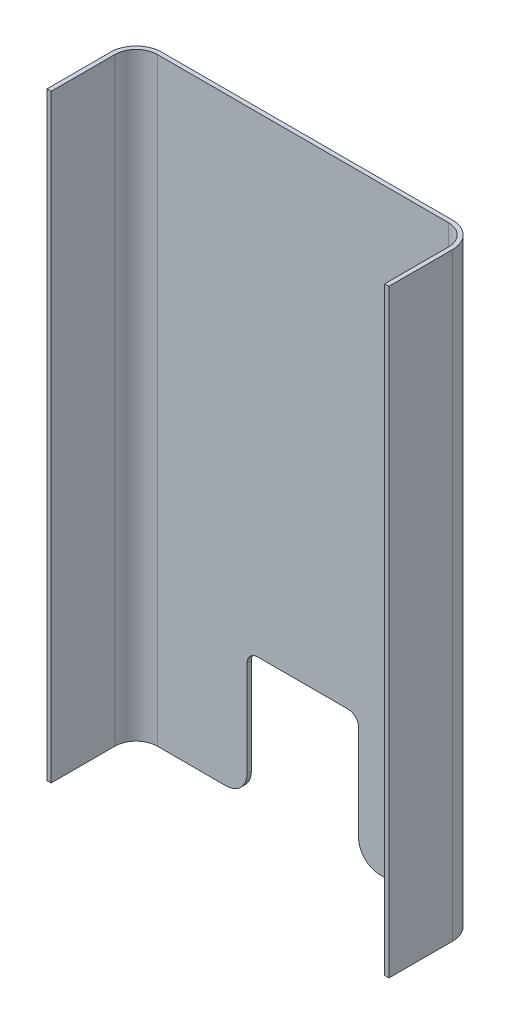
ISO-10303-21;
HEADER;
FILE_DESCRIPTION(('STEP AP214'),'2;1');
FILE_NAME('part.step','',(''),(''),'','','');
FILE_SCHEMA(('AUTOMOTIVE_DESIGN { 1 0 10303 214 1 1 1 1 }'));
ENDSEC;
DATA;
#1=APPLICATION_CONTEXT('core data for automotive mechanical design processes');
#2=APPLICATION_PROTOCOL_DEFINITION('international standard','automotive_design',2000,#1);
#3=PRODUCT_CONTEXT('',#1,'mechanical');
#4=PRODUCT('Part','Part','',(#3));
#5=PRODUCT_RELATED_PRODUCT_CATEGORY('part','',(#4));
#6=PRODUCT_DEFINITION_FORMATION('','',#4);
#7=PRODUCT_DEFINITION_CONTEXT('part definition',#1,'design');
#8=PRODUCT_DEFINITION('design','',#6,#7);
#9=PRODUCT_DEFINITION_SHAPE('','',#8);
#10=(LENGTH_UNIT() NAMED_UNIT(*) SI_UNIT(.MILLI.,.METRE.));
#11=(NAMED_UNIT(*) PLANE_ANGLE_UNIT() SI_UNIT($,.RADIAN.));
#12=(NAMED_UNIT(*) SI_UNIT($,.STERADIAN.) SOLID_ANGLE_UNIT());
#13=UNCERTAINTY_MEASURE_WITH_UNIT(LENGTH_MEASURE(1.E-05),#10,'distance_accuracy_value','');
#14=(GEOMETRIC_REPRESENTATION_CONTEXT(3) GLOBAL_UNCERTAINTY_ASSIGNED_CONTEXT((#13)) GLOBAL_UNIT_ASSIGNED_CONTEXT((#10,
#11,#12)) REPRESENTATION_CONTEXT('',''));
#15=CARTESIAN_POINT('',(0.,0.,0.));
#16=DIRECTION('',(0.,0.,1.));
#17=DIRECTION('',(1.,0.,0.));
#18=AXIS2_PLACEMENT_3D('',#15,#16,#17);
#19=CARTESIAN_POINT('',(137.,0.,20.));
#20=DIRECTION('',(0.,1.,0.));
#21=DIRECTION('',(1.,0.,0.));
#22=AXIS2_PLACEMENT_3D('',#19,#20,#21);
#23=PLANE('',#22);
#24=DIRECTION('',(1.,0.,0.));
#25=VECTOR('',#24,1.);
#26=CARTESIAN_POINT('',(-137.,0.,0.));
#27=LINE('',#26,#25);
#28=CARTESIAN_POINT('',(72.5,0.,0.));
#29=VERTEX_POINT('',#28);
#30=CARTESIAN_POINT('',(137.,0.,0.));
#31=VERTEX_POINT('',#30);
#32=EDGE_CURVE('E287',#29,#31,#27,.T.);
#33=ORIENTED_EDGE('',*,*,#32,.F.);
#34=DIRECTION('',(0.,0.,-1.));
#35=VECTOR('',#34,1.);
#36=CARTESIAN_POINT('',(72.5,0.,20.));
#37=LINE('',#36,#35);
#38=CARTESIAN_POINT('',(72.5,0.,-4.));
#39=VERTEX_POINT('',#38);
#40=EDGE_CURVE('E54',#29,#39,#37,.T.);
#41=ORIENTED_EDGE('',*,*,#40,.T.);
#42=DIRECTION('',(1.,0.,0.));
#43=VECTOR('',#42,1.);
#44=CARTESIAN_POINT('',(-137.,0.,-4.));
#45=LINE('',#44,#43);
#46=CARTESIAN_POINT('',(137.,0.,-3.99999999999999));
#47=VERTEX_POINT('',#46);
#48=EDGE_CURVE('E264',#39,#47,#45,.T.);
#49=ORIENTED_EDGE('',*,*,#48,.T.);
#50=CARTESIAN_POINT('',(137.,0.,20.));
#51=DIRECTION('',(0.,1.,0.));
#52=DIRECTION('',(1.,0.,0.));
#53=AXIS2_PLACEMENT_3D('',#50,#51,#52);
#54=CIRCLE('',#53,24.);
#55=CARTESIAN_POINT('',(161.,0.,20.));
#56=VERTEX_POINT('',#55);
#57=EDGE_CURVE('E260',#47,#56,#54,.F.);
#58=ORIENTED_EDGE('',*,*,#57,.T.);
#59=DIRECTION('',(0.,0.,-1.));
#60=VECTOR('',#59,1.);
#61=CARTESIAN_POINT('',(161.,0.,20.));
#62=LINE('',#61,#60);
#63=CARTESIAN_POINT('',(161.,0.,80.));
#64=VERTEX_POINT('',#63);
#65=EDGE_CURVE('E256',#56,#64,#62,.F.);
#66=ORIENTED_EDGE('',*,*,#65,.T.);
#67=DIRECTION('',(-1.,0.,0.));
#68=VECTOR('',#67,1.);
#69=CARTESIAN_POINT('',(161.,0.,80.));
#70=LINE('',#69,#68);
#71=CARTESIAN_POINT('',(157.,0.,80.));
#72=VERTEX_POINT('',#71);
#73=EDGE_CURVE('E252',#64,#72,#70,.T.);
#74=ORIENTED_EDGE('',*,*,#73,.T.);
#75=DIRECTION('',(0.,0.,1.));
#76=VECTOR('',#75,1.);
#77=CARTESIAN_POINT('',(157.,0.,20.));
#78=LINE('',#77,#76);
#79=CARTESIAN_POINT('',(157.,0.,20.));
#80=VERTEX_POINT('',#79);
#81=EDGE_CURVE('E202',#80,#72,#78,.T.);
#82=ORIENTED_EDGE('',*,*,#81,.F.);
#83=CARTESIAN_POINT('',(137.,0.,20.));
#84=DIRECTION('',(0.,-1.,0.));
#85=DIRECTION('',(0.,0.,-1.));
#86=AXIS2_PLACEMENT_3D('',#83,#84,#85);
#87=CIRCLE('',#86,20.);
#88=EDGE_CURVE('E196',#31,#80,#87,.T.);
#89=ORIENTED_EDGE('',*,*,#88,.F.);
#90=EDGE_LOOP('',(#33,#41,#49,#58,#66,#74,#82,#89));
#91=FACE_BOUND('',#90,.T.);
#92=ADVANCED_FACE('F45',(#91),#23,.F.);
#93=CARTESIAN_POINT('',(157.,564.,20.));
#94=DIRECTION('',(1.,0.,0.));
#95=DIRECTION('',(0.,0.,-1.));
#96=AXIS2_PLACEMENT_3D('',#93,#94,#95);
#97=PLANE('',#96);
#98=ORIENTED_EDGE('',*,*,#81,.T.);
#99=DIRECTION('',(0.,-1.,0.));
#100=VECTOR('',#99,1.);
#101=CARTESIAN_POINT('',(157.,564.,80.));
#102=LINE('',#101,#100);
#103=CARTESIAN_POINT('',(157.,564.,80.));
#104=VERTEX_POINT('',#103);
#105=EDGE_CURVE('E199',#104,#72,#102,.T.);
#106=ORIENTED_EDGE('',*,*,#105,.F.);
#107=DIRECTION('',(0.,0.,1.));
#108=VECTOR('',#107,1.);
#109=CARTESIAN_POINT('',(157.,564.,20.));
#110=LINE('',#109,#108);
#111=CARTESIAN_POINT('',(157.,564.,20.));
#112=VERTEX_POINT('',#111);
#113=EDGE_CURVE('E183',#112,#104,#110,.T.);
#114=ORIENTED_EDGE('',*,*,#113,.F.);
#115=DIRECTION('',(0.,-1.,0.));
#116=VECTOR('',#115,1.);
#117=CARTESIAN_POINT('',(157.,564.,20.));
#118=LINE('',#117,#116);
#119=EDGE_CURVE('E249',#112,#80,#118,.T.);
#120=ORIENTED_EDGE('',*,*,#119,.T.);
#121=EDGE_LOOP('',(#98,#106,#114,#120));
#122=FACE_BOUND('',#121,.T.);
#123=ADVANCED_FACE('F200',(#122),#97,.F.);
#124=CARTESIAN_POINT('',(161.,564.,80.));
#125=DIRECTION('',(0.,0.,1.));
#126=DIRECTION('',(1.,0.,0.));
#127=AXIS2_PLACEMENT_3D('',#124,#125,#126);
#128=PLANE('',#127);
#129=ORIENTED_EDGE('',*,*,#73,.F.);
#130=DIRECTION('',(0.,-1.,0.));
#131=VECTOR('',#130,1.);
#132=CARTESIAN_POINT('',(161.,564.,80.));
#133=LINE('',#132,#131);
#134=CARTESIAN_POINT('',(161.,564.,80.));
#135=VERTEX_POINT('',#134);
#136=EDGE_CURVE('E208',#135,#64,#133,.T.);
#137=ORIENTED_EDGE('',*,*,#136,.F.);
#138=DIRECTION('',(-1.,0.,0.));
#139=VECTOR('',#138,1.);
#140=CARTESIAN_POINT('',(161.,564.,80.));
#141=LINE('',#140,#139);
#142=EDGE_CURVE('E188',#135,#104,#141,.T.);
#143=ORIENTED_EDGE('',*,*,#142,.T.);
#144=ORIENTED_EDGE('',*,*,#105,.T.);
#145=EDGE_LOOP('',(#129,#137,#143,#144));
#146=FACE_BOUND('',#145,.T.);
#147=ADVANCED_FACE('F210',(#146),#128,.T.);
#148=CARTESIAN_POINT('',(161.,564.,20.));
#149=DIRECTION('',(1.,0.,0.));
#150=DIRECTION('',(0.,0.,-1.));
#151=AXIS2_PLACEMENT_3D('',#148,#149,#150);
#152=PLANE('',#151);
#153=ORIENTED_EDGE('',*,*,#65,.F.);
#154=DIRECTION('',(0.,-1.,0.));
#155=VECTOR('',#154,1.);
#156=CARTESIAN_POINT('',(161.,564.,20.));
#157=LINE('',#156,#155);
#158=CARTESIAN_POINT('',(161.,564.,20.));
#159=VERTEX_POINT('',#158);
#160=EDGE_CURVE('E324',#159,#56,#157,.T.);
#161=ORIENTED_EDGE('',*,*,#160,.F.);
#162=DIRECTION('',(0.,0.,-1.));
#163=VECTOR('',#162,1.);
#164=CARTESIAN_POINT('',(161.,564.,20.));
#165=LINE('',#164,#163);
#166=EDGE_CURVE('E212',#159,#135,#165,.F.);
#167=ORIENTED_EDGE('',*,*,#166,.T.);
#168=ORIENTED_EDGE('',*,*,#136,.T.);
#169=EDGE_LOOP('',(#153,#161,#167,#168));
#170=FACE_BOUND('',#169,.T.);
#171=ADVANCED_FACE('F484',(#170),#152,.T.);
#172=CARTESIAN_POINT('',(137.,564.,20.));
#173=DIRECTION('',(0.,-1.,0.));
#174=DIRECTION('',(0.,0.,-1.));
#175=AXIS2_PLACEMENT_3D('',#172,#173,#174);
#176=CYLINDRICAL_SURFACE('',#175,24.);
#177=ORIENTED_EDGE('',*,*,#57,.F.);
#178=DIRECTION('',(0.,-1.,0.));
#179=VECTOR('',#178,1.);
#180=CARTESIAN_POINT('',(137.,564.,-3.99999999999999));
#181=LINE('',#180,#179);
#182=CARTESIAN_POINT('',(137.,564.,-3.99999999999999));
#183=VERTEX_POINT('',#182);
#184=EDGE_CURVE('E320',#183,#47,#181,.T.);
#185=ORIENTED_EDGE('',*,*,#184,.F.);
#186=CARTESIAN_POINT('',(137.,564.,20.));
#187=DIRECTION('',(0.,1.,0.));
#188=DIRECTION('',(1.,0.,0.));
#189=AXIS2_PLACEMENT_3D('',#186,#187,#188);
#190=CIRCLE('',#189,24.);
#191=EDGE_CURVE('E215',#183,#159,#190,.F.);
#192=ORIENTED_EDGE('',*,*,#191,.T.);
#193=ORIENTED_EDGE('',*,*,#160,.T.);
#194=EDGE_LOOP('',(#177,#185,#192,#193));
#195=FACE_BOUND('',#194,.T.);
#196=ADVANCED_FACE('F486',(#195),#176,.T.);
#197=CARTESIAN_POINT('',(-137.,564.,-4.));
#198=DIRECTION('',(0.,0.,-1.));
#199=DIRECTION('',(-1.,0.,0.));
#200=AXIS2_PLACEMENT_3D('',#197,#198,#199);
#201=PLANE('',#200);
#202=DIRECTION('',(0.,1.,0.));
#203=VECTOR('',#202,1.);
#204=CARTESIAN_POINT('',(-52.5,564.,-4.));
#205=LINE('',#204,#203);
#206=CARTESIAN_POINT('',(-52.5,20.,-4.));
#207=VERTEX_POINT('',#206);
#208=CARTESIAN_POINT('',(-52.5,110.,-4.));
#209=VERTEX_POINT('',#208);
#210=EDGE_CURVE('E395',#207,#209,#205,.T.);
#211=ORIENTED_EDGE('',*,*,#210,.F.);
#212=CARTESIAN_POINT('',(-72.5,20.,-4.));
#213=DIRECTION('',(0.,0.,-1.));
#214=DIRECTION('',(-1.,0.,0.));
#215=AXIS2_PLACEMENT_3D('',#212,#213,#214);
#216=CIRCLE('',#215,20.);
#217=CARTESIAN_POINT('',(-72.5,0.,-4.));
#218=VERTEX_POINT('',#217);
#219=EDGE_CURVE('E375',#207,#218,#216,.T.);
#220=ORIENTED_EDGE('',*,*,#219,.T.);
#221=CARTESIAN_POINT('',(-137.,0.,-4.));
#222=VERTEX_POINT('',#221);
#223=EDGE_CURVE('E265',#222,#218,#45,.T.);
#224=ORIENTED_EDGE('',*,*,#223,.F.);
#225=DIRECTION('',(0.,-1.,0.));
#226=VECTOR('',#225,1.);
#227=CARTESIAN_POINT('',(-137.,564.,-4.));
#228=LINE('',#227,#226);
#229=CARTESIAN_POINT('',(-137.,564.,-4.));
#230=VERTEX_POINT('',#229);
#231=EDGE_CURVE('E317',#230,#222,#228,.T.);
#232=ORIENTED_EDGE('',*,*,#231,.F.);
#233=DIRECTION('',(1.,0.,0.));
#234=VECTOR('',#233,1.);
#235=CARTESIAN_POINT('',(-137.,564.,-4.));
#236=LINE('',#235,#234);
#237=EDGE_CURVE('E222',#230,#183,#236,.T.);
#238=ORIENTED_EDGE('',*,*,#237,.T.);
#239=ORIENTED_EDGE('',*,*,#184,.T.);
#240=ORIENTED_EDGE('',*,*,#48,.F.);
#241=CARTESIAN_POINT('',(72.5,20.,-4.));
#242=DIRECTION('',(0.,0.,-1.));
#243=DIRECTION('',(-1.,0.,0.));
#244=AXIS2_PLACEMENT_3D('',#241,#242,#243);
#245=CIRCLE('',#244,20.);
#246=CARTESIAN_POINT('',(52.5,20.,-4.));
#247=VERTEX_POINT('',#246);
#248=EDGE_CURVE('E61',#39,#247,#245,.T.);
#249=ORIENTED_EDGE('',*,*,#248,.T.);
#250=DIRECTION('',(0.,-1.,0.));
#251=VECTOR('',#250,1.);
#252=CARTESIAN_POINT('',(52.5,564.,-4.));
#253=LINE('',#252,#251);
#254=CARTESIAN_POINT('',(52.5,110.,-4.));
#255=VERTEX_POINT('',#254);
#256=EDGE_CURVE('E389',#255,#247,#253,.T.);
#257=ORIENTED_EDGE('',*,*,#256,.F.);
#258=CARTESIAN_POINT('',(42.5,110.,-4.));
#259=DIRECTION('',(0.,0.,-1.));
#260=DIRECTION('',(-1.,0.,0.));
#261=AXIS2_PLACEMENT_3D('',#258,#259,#260);
#262=CIRCLE('',#261,10.);
#263=CARTESIAN_POINT('',(42.5,120.,-4.));
#264=VERTEX_POINT('',#263);
#265=EDGE_CURVE('E354',#255,#264,#262,.F.);
#266=ORIENTED_EDGE('',*,*,#265,.T.);
#267=DIRECTION('',(1.,0.,0.));
#268=VECTOR('',#267,1.);
#269=CARTESIAN_POINT('',(-137.,120.,-4.));
#270=LINE('',#269,#268);
#271=CARTESIAN_POINT('',(-42.5,120.,-4.));
#272=VERTEX_POINT('',#271);
#273=EDGE_CURVE('E253',#272,#264,#270,.T.);
#274=ORIENTED_EDGE('',*,*,#273,.F.);
#275=CARTESIAN_POINT('',(-42.5,110.,-4.));
#276=DIRECTION('',(0.,0.,-1.));
#277=DIRECTION('',(-1.,0.,0.));
#278=AXIS2_PLACEMENT_3D('',#275,#276,#277);
#279=CIRCLE('',#278,10.);
#280=EDGE_CURVE('E347',#272,#209,#279,.F.);
#281=ORIENTED_EDGE('',*,*,#280,.T.);
#282=EDGE_LOOP('',(#211,#220,#224,#232,#238,#239,#240,#249,#257,#266,#274,#281));
#283=FACE_BOUND('',#282,.T.);
#284=ADVANCED_FACE('F383',(#283),#201,.T.);
#285=CARTESIAN_POINT('',(-137.,564.,20.));
#286=DIRECTION('',(0.,-1.,0.));
#287=DIRECTION('',(0.,0.,-1.));
#288=AXIS2_PLACEMENT_3D('',#285,#286,#287);
#289=CYLINDRICAL_SURFACE('',#288,24.);
#290=CARTESIAN_POINT('',(-137.,0.,20.));
#291=DIRECTION('',(0.,1.,0.));
#292=DIRECTION('',(1.,0.,0.));
#293=AXIS2_PLACEMENT_3D('',#290,#291,#292);
#294=CIRCLE('',#293,24.);
#295=CARTESIAN_POINT('',(-161.,0.,20.));
#296=VERTEX_POINT('',#295);
#297=EDGE_CURVE('E269',#296,#222,#294,.F.);
#298=ORIENTED_EDGE('',*,*,#297,.F.);
#299=DIRECTION('',(0.,-1.,0.));
#300=VECTOR('',#299,1.);
#301=CARTESIAN_POINT('',(-161.,564.,20.));
#302=LINE('',#301,#300);
#303=CARTESIAN_POINT('',(-161.,564.,20.));
#304=VERTEX_POINT('',#303);
#305=EDGE_CURVE('E314',#304,#296,#302,.T.);
#306=ORIENTED_EDGE('',*,*,#305,.F.);
#307=CARTESIAN_POINT('',(-137.,564.,20.));
#308=DIRECTION('',(0.,1.,0.));
#309=DIRECTION('',(1.,0.,0.));
#310=AXIS2_PLACEMENT_3D('',#307,#308,#309);
#311=CIRCLE('',#310,24.);
#312=EDGE_CURVE('E226',#304,#230,#311,.F.);
#313=ORIENTED_EDGE('',*,*,#312,.T.);
#314=ORIENTED_EDGE('',*,*,#231,.T.);
#315=EDGE_LOOP('',(#298,#306,#313,#314));
#316=FACE_BOUND('',#315,.T.);
#317=ADVANCED_FACE('F461',(#316),#289,.T.);
#318=CARTESIAN_POINT('',(-161.,564.,80.));
#319=DIRECTION('',(-1.,0.,0.));
#320=DIRECTION('',(0.,0.,1.));
#321=AXIS2_PLACEMENT_3D('',#318,#319,#320);
#322=PLANE('',#321);
#323=DIRECTION('',(0.,0.,-1.));
#324=VECTOR('',#323,1.);
#325=CARTESIAN_POINT('',(-161.,0.,80.));
#326=LINE('',#325,#324);
#327=CARTESIAN_POINT('',(-161.,0.,80.));
#328=VERTEX_POINT('',#327);
#329=EDGE_CURVE('E273',#328,#296,#326,.T.);
#330=ORIENTED_EDGE('',*,*,#329,.F.);
#331=DIRECTION('',(0.,-1.,0.));
#332=VECTOR('',#331,1.);
#333=CARTESIAN_POINT('',(-161.,564.,80.));
#334=LINE('',#333,#332);
#335=CARTESIAN_POINT('',(-161.,564.,80.));
#336=VERTEX_POINT('',#335);
#337=EDGE_CURVE('E311',#336,#328,#334,.T.);
#338=ORIENTED_EDGE('',*,*,#337,.F.);
#339=DIRECTION('',(0.,0.,-1.));
#340=VECTOR('',#339,1.);
#341=CARTESIAN_POINT('',(-161.,564.,80.));
#342=LINE('',#341,#340);
#343=EDGE_CURVE('E230',#336,#304,#342,.T.);
#344=ORIENTED_EDGE('',*,*,#343,.T.);
#345=ORIENTED_EDGE('',*,*,#305,.T.);
#346=EDGE_LOOP('',(#330,#338,#344,#345));
#347=FACE_BOUND('',#346,.T.);
#348=ADVANCED_FACE('F464',(#347),#322,.T.);
#349=CARTESIAN_POINT('',(-157.,564.,80.));
#350=DIRECTION('',(0.,0.,1.));
#351=DIRECTION('',(1.,0.,0.));
#352=AXIS2_PLACEMENT_3D('',#349,#350,#351);
#353=PLANE('',#352);
#354=DIRECTION('',(-1.,0.,0.));
#355=VECTOR('',#354,1.);
#356=CARTESIAN_POINT('',(-157.,0.,80.));
#357=LINE('',#356,#355);
#358=CARTESIAN_POINT('',(-157.,0.,80.));
#359=VERTEX_POINT('',#358);
#360=EDGE_CURVE('E277',#359,#328,#357,.T.);
#361=ORIENTED_EDGE('',*,*,#360,.F.);
#362=DIRECTION('',(0.,-1.,0.));
#363=VECTOR('',#362,1.);
#364=CARTESIAN_POINT('',(-157.,564.,80.));
#365=LINE('',#364,#363);
#366=CARTESIAN_POINT('',(-157.,564.,80.));
#367=VERTEX_POINT('',#366);
#368=EDGE_CURVE('E308',#367,#359,#365,.T.);
#369=ORIENTED_EDGE('',*,*,#368,.F.);
#370=DIRECTION('',(-1.,0.,0.));
#371=VECTOR('',#370,1.);
#372=CARTESIAN_POINT('',(-157.,564.,80.));
#373=LINE('',#372,#371);
#374=EDGE_CURVE('E234',#367,#336,#373,.T.);
#375=ORIENTED_EDGE('',*,*,#374,.T.);
#376=ORIENTED_EDGE('',*,*,#337,.T.);
#377=EDGE_LOOP('',(#361,#369,#375,#376));
#378=FACE_BOUND('',#377,.T.);
#379=ADVANCED_FACE('F468',(#378),#353,.T.);
#380=CARTESIAN_POINT('',(-157.,564.,80.));
#381=DIRECTION('',(-1.,0.,0.));
#382=DIRECTION('',(0.,0.,1.));
#383=AXIS2_PLACEMENT_3D('',#380,#381,#382);
#384=PLANE('',#383);
#385=DIRECTION('',(0.,0.,-1.));
#386=VECTOR('',#385,1.);
#387=CARTESIAN_POINT('',(-157.,0.,80.));
#388=LINE('',#387,#386);
#389=CARTESIAN_POINT('',(-157.,0.,20.));
#390=VERTEX_POINT('',#389);
#391=EDGE_CURVE('E281',#359,#390,#388,.T.);
#392=ORIENTED_EDGE('',*,*,#391,.T.);
#393=DIRECTION('',(0.,-1.,0.));
#394=VECTOR('',#393,1.);
#395=CARTESIAN_POINT('',(-157.,564.,20.));
#396=LINE('',#395,#394);
#397=CARTESIAN_POINT('',(-157.,564.,20.));
#398=VERTEX_POINT('',#397);
#399=EDGE_CURVE('E304',#398,#390,#396,.T.);
#400=ORIENTED_EDGE('',*,*,#399,.F.);
#401=DIRECTION('',(0.,0.,-1.));
#402=VECTOR('',#401,1.);
#403=CARTESIAN_POINT('',(-157.,564.,80.));
#404=LINE('',#403,#402);
#405=EDGE_CURVE('E238',#367,#398,#404,.T.);
#406=ORIENTED_EDGE('',*,*,#405,.F.);
#407=ORIENTED_EDGE('',*,*,#368,.T.);
#408=EDGE_LOOP('',(#392,#400,#406,#407));
#409=FACE_BOUND('',#408,.T.);
#410=ADVANCED_FACE('F473',(#409),#384,.F.);
#411=CARTESIAN_POINT('',(-137.,564.,20.));
#412=DIRECTION('',(0.,-1.,0.));
#413=DIRECTION('',(0.,0.,-1.));
#414=AXIS2_PLACEMENT_3D('',#411,#412,#413);
#415=CYLINDRICAL_SURFACE('',#414,20.);
#416=CARTESIAN_POINT('',(-137.,0.,20.));
#417=DIRECTION('',(0.,-1.,0.));
#418=DIRECTION('',(0.,0.,-1.));
#419=AXIS2_PLACEMENT_3D('',#416,#417,#418);
#420=CIRCLE('',#419,20.);
#421=CARTESIAN_POINT('',(-137.,0.,0.));
#422=VERTEX_POINT('',#421);
#423=EDGE_CURVE('E284',#390,#422,#420,.T.);
#424=ORIENTED_EDGE('',*,*,#423,.T.);
#425=DIRECTION('',(0.,-1.,0.));
#426=VECTOR('',#425,1.);
#427=CARTESIAN_POINT('',(-137.,564.,0.));
#428=LINE('',#427,#426);
#429=CARTESIAN_POINT('',(-137.,564.,0.));
#430=VERTEX_POINT('',#429);
#431=EDGE_CURVE('E300',#430,#422,#428,.T.);
#432=ORIENTED_EDGE('',*,*,#431,.F.);
#433=CARTESIAN_POINT('',(-137.,564.,20.));
#434=DIRECTION('',(0.,-1.,0.));
#435=DIRECTION('',(0.,0.,-1.));
#436=AXIS2_PLACEMENT_3D('',#433,#434,#435);
#437=CIRCLE('',#436,20.);
#438=EDGE_CURVE('E241',#398,#430,#437,.T.);
#439=ORIENTED_EDGE('',*,*,#438,.F.);
#440=ORIENTED_EDGE('',*,*,#399,.T.);
#441=EDGE_LOOP('',(#424,#432,#439,#440));
#442=FACE_BOUND('',#441,.T.);
#443=ADVANCED_FACE('F479',(#442),#415,.F.);
#444=CARTESIAN_POINT('',(-137.,564.,0.));
#445=DIRECTION('',(0.,0.,-1.));
#446=DIRECTION('',(-1.,0.,0.));
#447=AXIS2_PLACEMENT_3D('',#444,#445,#446);
#448=PLANE('',#447);
#449=CARTESIAN_POINT('',(-72.5,0.,0.));
#450=VERTEX_POINT('',#449);
#451=EDGE_CURVE('E288',#422,#450,#27,.T.);
#452=ORIENTED_EDGE('',*,*,#451,.T.);
#453=CARTESIAN_POINT('',(-72.5,20.,0.));
#454=DIRECTION('',(0.,0.,-1.));
#455=DIRECTION('',(-1.,0.,0.));
#456=AXIS2_PLACEMENT_3D('',#453,#454,#455);
#457=CIRCLE('',#456,20.);
#458=CARTESIAN_POINT('',(-52.5,20.,0.));
#459=VERTEX_POINT('',#458);
#460=EDGE_CURVE('E367',#450,#459,#457,.F.);
#461=ORIENTED_EDGE('',*,*,#460,.T.);
#462=DIRECTION('',(0.,1.,0.));
#463=VECTOR('',#462,1.);
#464=CARTESIAN_POINT('',(-52.5,564.,0.));
#465=LINE('',#464,#463);
#466=CARTESIAN_POINT('',(-52.5,110.,0.));
#467=VERTEX_POINT('',#466);
#468=EDGE_CURVE('E398',#459,#467,#465,.T.);
#469=ORIENTED_EDGE('',*,*,#468,.T.);
#470=CARTESIAN_POINT('',(-42.5,110.,0.));
#471=DIRECTION('',(0.,0.,-1.));
#472=DIRECTION('',(-1.,0.,0.));
#473=AXIS2_PLACEMENT_3D('',#470,#471,#472);
#474=CIRCLE('',#473,10.);
#475=CARTESIAN_POINT('',(-42.5,120.,0.));
#476=VERTEX_POINT('',#475);
#477=EDGE_CURVE('E351',#467,#476,#474,.T.);
#478=ORIENTED_EDGE('',*,*,#477,.T.);
#479=DIRECTION('',(1.,0.,0.));
#480=VECTOR('',#479,1.);
#481=CARTESIAN_POINT('',(-137.,120.,0.));
#482=LINE('',#481,#480);
#483=CARTESIAN_POINT('',(42.5,120.,0.));
#484=VERTEX_POINT('',#483);
#485=EDGE_CURVE('E207',#476,#484,#482,.T.);
#486=ORIENTED_EDGE('',*,*,#485,.T.);
#487=CARTESIAN_POINT('',(42.5,110.,0.));
#488=DIRECTION('',(0.,0.,-1.));
#489=DIRECTION('',(-1.,0.,0.));
#490=AXIS2_PLACEMENT_3D('',#487,#488,#489);
#491=CIRCLE('',#490,10.);
#492=CARTESIAN_POINT('',(52.5,110.,0.));
#493=VERTEX_POINT('',#492);
#494=EDGE_CURVE('E357',#484,#493,#491,.T.);
#495=ORIENTED_EDGE('',*,*,#494,.T.);
#496=DIRECTION('',(0.,-1.,0.));
#497=VECTOR('',#496,1.);
#498=CARTESIAN_POINT('',(52.5,564.,0.));
#499=LINE('',#498,#497);
#500=CARTESIAN_POINT('',(52.5,20.,0.));
#501=VERTEX_POINT('',#500);
#502=EDGE_CURVE('E391',#493,#501,#499,.T.);
#503=ORIENTED_EDGE('',*,*,#502,.T.);
#504=CARTESIAN_POINT('',(72.5,20.,0.));
#505=DIRECTION('',(0.,0.,-1.));
#506=DIRECTION('',(-1.,0.,0.));
#507=AXIS2_PLACEMENT_3D('',#504,#505,#506);
#508=CIRCLE('',#507,20.);
#509=EDGE_CURVE('E364',#501,#29,#508,.F.);
#510=ORIENTED_EDGE('',*,*,#509,.T.);
#511=ORIENTED_EDGE('',*,*,#32,.T.);
#512=DIRECTION('',(0.,-1.,0.));
#513=VECTOR('',#512,1.);
#514=CARTESIAN_POINT('',(137.,564.,0.));
#515=LINE('',#514,#513);
#516=CARTESIAN_POINT('',(137.,564.,0.));
#517=VERTEX_POINT('',#516);
#518=EDGE_CURVE('E296',#517,#31,#515,.T.);
#519=ORIENTED_EDGE('',*,*,#518,.F.);
#520=DIRECTION('',(1.,0.,0.));
#521=VECTOR('',#520,1.);
#522=CARTESIAN_POINT('',(-137.,564.,0.));
#523=LINE('',#522,#521);
#524=EDGE_CURVE('E244',#430,#517,#523,.T.);
#525=ORIENTED_EDGE('',*,*,#524,.F.);
#526=ORIENTED_EDGE('',*,*,#431,.T.);
#527=EDGE_LOOP('',(#452,#461,#469,#478,#486,#495,#503,#510,#511,#519,#525,#526));
#528=FACE_BOUND('',#527,.T.);
#529=ADVANCED_FACE('F403',(#528),#448,.F.);
#530=CARTESIAN_POINT('',(137.,564.,20.));
#531=DIRECTION('',(0.,-1.,0.));
#532=DIRECTION('',(0.,0.,-1.));
#533=AXIS2_PLACEMENT_3D('',#530,#531,#532);
#534=CYLINDRICAL_SURFACE('',#533,20.);
#535=ORIENTED_EDGE('',*,*,#88,.T.);
#536=ORIENTED_EDGE('',*,*,#119,.F.);
#537=CARTESIAN_POINT('',(137.,564.,20.));
#538=DIRECTION('',(0.,-1.,0.));
#539=DIRECTION('',(0.,0.,-1.));
#540=AXIS2_PLACEMENT_3D('',#537,#538,#539);
#541=CIRCLE('',#540,20.);
#542=EDGE_CURVE('E191',#517,#112,#541,.T.);
#543=ORIENTED_EDGE('',*,*,#542,.F.);
#544=ORIENTED_EDGE('',*,*,#518,.T.);
#545=EDGE_LOOP('',(#535,#536,#543,#544));
#546=FACE_BOUND('',#545,.T.);
#547=ADVANCED_FACE('F450',(#546),#534,.F.);
#548=CARTESIAN_POINT('',(137.,564.,20.));
#549=DIRECTION('',(0.,1.,0.));
#550=DIRECTION('',(1.,0.,0.));
#551=AXIS2_PLACEMENT_3D('',#548,#549,#550);
#552=PLANE('',#551);
#553=ORIENTED_EDGE('',*,*,#113,.T.);
#554=ORIENTED_EDGE('',*,*,#142,.F.);
#555=ORIENTED_EDGE('',*,*,#166,.F.);
#556=ORIENTED_EDGE('',*,*,#191,.F.);
#557=ORIENTED_EDGE('',*,*,#237,.F.);
#558=ORIENTED_EDGE('',*,*,#312,.F.);
#559=ORIENTED_EDGE('',*,*,#343,.F.);
#560=ORIENTED_EDGE('',*,*,#374,.F.);
#561=ORIENTED_EDGE('',*,*,#405,.T.);
#562=ORIENTED_EDGE('',*,*,#438,.T.);
#563=ORIENTED_EDGE('',*,*,#524,.T.);
#564=ORIENTED_EDGE('',*,*,#542,.T.);
#565=EDGE_LOOP('',(#553,#554,#555,#556,#557,#558,#559,#560,#561,#562,#563,#564));
#566=FACE_BOUND('',#565,.T.);
#567=ADVANCED_FACE('F185',(#566),#552,.T.);
#568=ORIENTED_EDGE('',*,*,#223,.T.);
#569=DIRECTION('',(0.,0.,1.));
#570=VECTOR('',#569,1.);
#571=CARTESIAN_POINT('',(-72.5,0.,20.));
#572=LINE('',#571,#570);
#573=EDGE_CURVE('E360',#218,#450,#572,.T.);
#574=ORIENTED_EDGE('',*,*,#573,.T.);
#575=ORIENTED_EDGE('',*,*,#451,.F.);
#576=ORIENTED_EDGE('',*,*,#423,.F.);
#577=ORIENTED_EDGE('',*,*,#391,.F.);
#578=ORIENTED_EDGE('',*,*,#360,.T.);
#579=ORIENTED_EDGE('',*,*,#329,.T.);
#580=ORIENTED_EDGE('',*,*,#297,.T.);
#581=EDGE_LOOP('',(#568,#574,#575,#576,#577,#578,#579,#580));
#582=FACE_BOUND('',#581,.T.);
#583=ADVANCED_FACE('F432',(#582),#23,.F.);
#584=CARTESIAN_POINT('',(52.5,120.,80.));
#585=DIRECTION('',(0.,1.,0.));
#586=DIRECTION('',(0.,0.,1.));
#587=AXIS2_PLACEMENT_3D('',#584,#585,#586);
#588=PLANE('',#587);
#589=ORIENTED_EDGE('',*,*,#485,.F.);
#590=DIRECTION('',(0.,0.,-1.));
#591=VECTOR('',#590,1.);
#592=CARTESIAN_POINT('',(-42.5,120.,-3.99999999999998));
#593=LINE('',#592,#591);
#594=EDGE_CURVE('E335',#476,#272,#593,.T.);
#595=ORIENTED_EDGE('',*,*,#594,.T.);
#596=ORIENTED_EDGE('',*,*,#273,.T.);
#597=DIRECTION('',(0.,0.,-1.));
#598=VECTOR('',#597,1.);
#599=CARTESIAN_POINT('',(42.5,120.,0.));
#600=LINE('',#599,#598);
#601=EDGE_CURVE('E332',#264,#484,#600,.F.);
#602=ORIENTED_EDGE('',*,*,#601,.T.);
#603=EDGE_LOOP('',(#589,#595,#596,#602));
#604=FACE_BOUND('',#603,.T.);
#605=ADVANCED_FACE('F415',(#604),#588,.F.);
#606=CARTESIAN_POINT('',(52.5,-140.267111284852,80.));
#607=DIRECTION('',(1.,0.,0.));
#608=DIRECTION('',(0.,0.,-1.));
#609=AXIS2_PLACEMENT_3D('',#606,#607,#608);
#610=PLANE('',#609);
#611=ORIENTED_EDGE('',*,*,#256,.T.);
#612=DIRECTION('',(0.,0.,-1.));
#613=VECTOR('',#612,1.);
#614=CARTESIAN_POINT('',(52.5,20.,80.));
#615=LINE('',#614,#613);
#616=EDGE_CURVE('E11',#247,#501,#615,.F.);
#617=ORIENTED_EDGE('',*,*,#616,.T.);
#618=ORIENTED_EDGE('',*,*,#502,.F.);
#619=DIRECTION('',(0.,0.,-1.));
#620=VECTOR('',#619,1.);
#621=CARTESIAN_POINT('',(52.5,110.,-3.99999999999998));
#622=LINE('',#621,#620);
#623=EDGE_CURVE('E343',#493,#255,#622,.T.);
#624=ORIENTED_EDGE('',*,*,#623,.T.);
#625=EDGE_LOOP('',(#611,#617,#618,#624));
#626=FACE_BOUND('',#625,.T.);
#627=ADVANCED_FACE('F423',(#626),#610,.F.);
#628=CARTESIAN_POINT('',(-52.5,-140.267111284852,80.));
#629=DIRECTION('',(-1.,0.,0.));
#630=DIRECTION('',(0.,0.,1.));
#631=AXIS2_PLACEMENT_3D('',#628,#629,#630);
#632=PLANE('',#631);
#633=ORIENTED_EDGE('',*,*,#468,.F.);
#634=DIRECTION('',(0.,0.,1.));
#635=VECTOR('',#634,1.);
#636=CARTESIAN_POINT('',(-52.5,20.,80.));
#637=LINE('',#636,#635);
#638=EDGE_CURVE('E370',#459,#207,#637,.F.);
#639=ORIENTED_EDGE('',*,*,#638,.T.);
#640=ORIENTED_EDGE('',*,*,#210,.T.);
#641=DIRECTION('',(0.,0.,-1.));
#642=VECTOR('',#641,1.);
#643=CARTESIAN_POINT('',(-52.5,110.,0.));
#644=LINE('',#643,#642);
#645=EDGE_CURVE('E339',#209,#467,#644,.F.);
#646=ORIENTED_EDGE('',*,*,#645,.T.);
#647=EDGE_LOOP('',(#633,#639,#640,#646));
#648=FACE_BOUND('',#647,.T.);
#649=ADVANCED_FACE('F409',(#648),#632,.F.);
#650=CARTESIAN_POINT('',(-42.5,110.,80.));
#651=DIRECTION('',(0.,0.,1.));
#652=DIRECTION('',(1.,0.,0.));
#653=AXIS2_PLACEMENT_3D('',#650,#651,#652);
#654=CYLINDRICAL_SURFACE('',#653,10.);
#655=ORIENTED_EDGE('',*,*,#477,.F.);
#656=ORIENTED_EDGE('',*,*,#645,.F.);
#657=ORIENTED_EDGE('',*,*,#280,.F.);
#658=ORIENTED_EDGE('',*,*,#594,.F.);
#659=EDGE_LOOP('',(#655,#656,#657,#658));
#660=FACE_BOUND('',#659,.T.);
#661=ADVANCED_FACE('F412',(#660),#654,.F.);
#662=CARTESIAN_POINT('',(42.5,110.,80.));
#663=DIRECTION('',(0.,0.,1.));
#664=DIRECTION('',(1.,0.,0.));
#665=AXIS2_PLACEMENT_3D('',#662,#663,#664);
#666=CYLINDRICAL_SURFACE('',#665,10.);
#667=ORIENTED_EDGE('',*,*,#494,.F.);
#668=ORIENTED_EDGE('',*,*,#601,.F.);
#669=ORIENTED_EDGE('',*,*,#265,.F.);
#670=ORIENTED_EDGE('',*,*,#623,.F.);
#671=EDGE_LOOP('',(#667,#668,#669,#670));
#672=FACE_BOUND('',#671,.T.);
#673=ADVANCED_FACE('F420',(#672),#666,.F.);
#674=CARTESIAN_POINT('',(-72.5,20.,20.));
#675=DIRECTION('',(0.,0.,1.));
#676=DIRECTION('',(1.,0.,0.));
#677=AXIS2_PLACEMENT_3D('',#674,#675,#676);
#678=CYLINDRICAL_SURFACE('',#677,20.);
#679=ORIENTED_EDGE('',*,*,#219,.F.);
#680=ORIENTED_EDGE('',*,*,#638,.F.);
#681=ORIENTED_EDGE('',*,*,#460,.F.);
#682=ORIENTED_EDGE('',*,*,#573,.F.);
#683=EDGE_LOOP('',(#679,#680,#681,#682));
#684=FACE_BOUND('',#683,.T.);
#685=ADVANCED_FACE('F425',(#684),#678,.T.);
#686=CARTESIAN_POINT('',(72.5,20.,20.));
#687=DIRECTION('',(0.,0.,-1.));
#688=DIRECTION('',(-1.,0.,0.));
#689=AXIS2_PLACEMENT_3D('',#686,#687,#688);
#690=CYLINDRICAL_SURFACE('',#689,20.);
#691=ORIENTED_EDGE('',*,*,#509,.F.);
#692=ORIENTED_EDGE('',*,*,#616,.F.);
#693=ORIENTED_EDGE('',*,*,#248,.F.);
#694=ORIENTED_EDGE('',*,*,#40,.F.);
#695=EDGE_LOOP('',(#691,#692,#693,#694));
#696=FACE_BOUND('',#695,.T.);
#697=ADVANCED_FACE('F47',(#696),#690,.T.);
#698=CLOSED_SHELL('',(#92,#123,#147,#171,#196,#284,#317,#348,#379,#410,#443,#529,#547,#567,#583,
#605,#627,#649,#661,#673,#685,#697));
#699=MANIFOLD_SOLID_BREP('B2',#698);
#700=ADVANCED_BREP_SHAPE_REPRESENTATION('',(#18,#699),#14);
#701=SHAPE_DEFINITION_REPRESENTATION(#9,#700);
ENDSEC;
END-ISO-10303-21;
